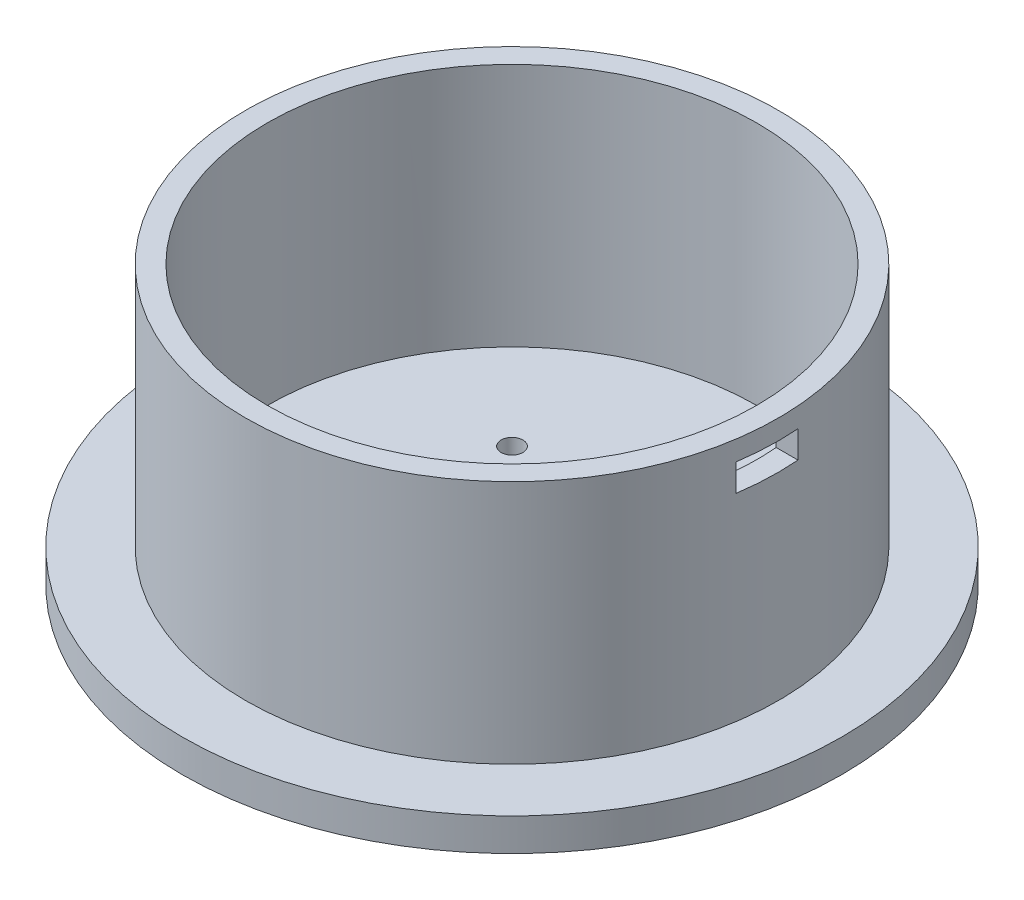
ISO-10303-21;
HEADER;
FILE_DESCRIPTION(('STEP AP214'),'2;1');
FILE_NAME('part.step','',(''),(''),'','','');
FILE_SCHEMA(('AUTOMOTIVE_DESIGN { 1 0 10303 214 1 1 1 1 }'));
ENDSEC;
DATA;
#1=APPLICATION_CONTEXT('core data for automotive mechanical design processes');
#2=APPLICATION_PROTOCOL_DEFINITION('international standard','automotive_design',2000,#1);
#3=PRODUCT_CONTEXT('',#1,'mechanical');
#4=PRODUCT('Part','Part','',(#3));
#5=PRODUCT_RELATED_PRODUCT_CATEGORY('part','',(#4));
#6=PRODUCT_DEFINITION_FORMATION('','',#4);
#7=PRODUCT_DEFINITION_CONTEXT('part definition',#1,'design');
#8=PRODUCT_DEFINITION('design','',#6,#7);
#9=PRODUCT_DEFINITION_SHAPE('','',#8);
#10=(LENGTH_UNIT() NAMED_UNIT(*) SI_UNIT(.MILLI.,.METRE.));
#11=(NAMED_UNIT(*) PLANE_ANGLE_UNIT() SI_UNIT($,.RADIAN.));
#12=(NAMED_UNIT(*) SI_UNIT($,.STERADIAN.) SOLID_ANGLE_UNIT());
#13=UNCERTAINTY_MEASURE_WITH_UNIT(LENGTH_MEASURE(1.E-05),#10,'distance_accuracy_value','');
#14=(GEOMETRIC_REPRESENTATION_CONTEXT(3) GLOBAL_UNCERTAINTY_ASSIGNED_CONTEXT((#13)) GLOBAL_UNIT_ASSIGNED_CONTEXT((#10,
#11,#12)) REPRESENTATION_CONTEXT('',''));
#15=CARTESIAN_POINT('',(0.,0.,0.));
#16=DIRECTION('',(0.,0.,1.));
#17=DIRECTION('',(1.,0.,0.));
#18=AXIS2_PLACEMENT_3D('',#15,#16,#17);
#19=CARTESIAN_POINT('',(-5.23328316127758,49.,-2.27534050490329));
#20=DIRECTION('',(0.,-1.,0.));
#21=DIRECTION('',(0.,0.,-1.));
#22=AXIS2_PLACEMENT_3D('',#19,#20,#21);
#23=CYLINDRICAL_SURFACE('',#22,49.);
#24=CARTESIAN_POINT('',(-5.23328316127758,4.,-2.27534050490329));
#25=DIRECTION('',(0.,1.,0.));
#26=DIRECTION('',(0.,0.,1.));
#27=AXIS2_PLACEMENT_3D('',#24,#25,#26);
#28=CIRCLE('',#27,49.);
#29=CARTESIAN_POINT('',(-5.23328316127758,4.,46.7246594950967));
#30=VERTEX_POINT('',#29);
#31=EDGE_CURVE('E159',#30,#30,#28,.T.);
#32=ORIENTED_EDGE('',*,*,#31,.T.);
#33=EDGE_LOOP('',(#32));
#34=FACE_BOUND('',#33,.T.);
#35=CARTESIAN_POINT('',(-5.23328316127758,49.,-2.27534050490329));
#36=DIRECTION('',(0.,1.,0.));
#37=DIRECTION('',(0.,0.,1.));
#38=AXIS2_PLACEMENT_3D('',#35,#36,#37);
#39=CIRCLE('',#38,49.);
#40=CARTESIAN_POINT('',(-5.23328316127758,49.,46.7246594950967));
#41=VERTEX_POINT('',#40);
#42=EDGE_CURVE('E160',#41,#41,#39,.T.);
#43=ORIENTED_EDGE('',*,*,#42,.F.);
#44=EDGE_LOOP('',(#43));
#45=FACE_BOUND('',#44,.T.);
#46=CARTESIAN_POINT('',(-5.23328316127758,45.3583951692781,-2.27534050490329));
#47=DIRECTION('',(0.,-1.,0.));
#48=DIRECTION('',(0.,0.,-1.));
#49=AXIS2_PLACEMENT_3D('',#46,#47,#48);
#50=CIRCLE('',#49,49.);
#51=CARTESIAN_POINT('',(43.6246222037724,45.3583951692781,-6.00429254801404));
#52=VERTEX_POINT('',#51);
#53=CARTESIAN_POINT('',(43.2242432057236,45.3583951692781,4.99570745198596));
#54=VERTEX_POINT('',#53);
#55=EDGE_CURVE('E171',#52,#54,#50,.T.);
#56=ORIENTED_EDGE('',*,*,#55,.F.);
#57=DIRECTION('',(0.,-1.,0.));
#58=VECTOR('',#57,1.);
#59=CARTESIAN_POINT('',(43.6246222037724,49.,-6.00429254801404));
#60=LINE('',#59,#58);
#61=CARTESIAN_POINT('',(43.6246222037724,40.3583951692781,-6.00429254801404));
#62=VERTEX_POINT('',#61);
#63=EDGE_CURVE('E12',#62,#52,#60,.F.);
#64=ORIENTED_EDGE('',*,*,#63,.F.);
#65=CARTESIAN_POINT('',(-5.23328316127758,40.3583951692781,-2.27534050490329));
#66=DIRECTION('',(0.,-1.,0.));
#67=DIRECTION('',(0.,0.,-1.));
#68=AXIS2_PLACEMENT_3D('',#65,#66,#67);
#69=CIRCLE('',#68,49.);
#70=CARTESIAN_POINT('',(43.2242432057236,40.3583951692781,4.99570745198596));
#71=VERTEX_POINT('',#70);
#72=EDGE_CURVE('E57',#62,#71,#69,.T.);
#73=ORIENTED_EDGE('',*,*,#72,.T.);
#74=DIRECTION('',(0.,-1.,0.));
#75=VECTOR('',#74,1.);
#76=CARTESIAN_POINT('',(43.2242432057236,49.,4.99570745198596));
#77=LINE('',#76,#75);
#78=EDGE_CURVE('E173',#71,#54,#77,.F.);
#79=ORIENTED_EDGE('',*,*,#78,.T.);
#80=EDGE_LOOP('',(#56,#64,#73,#79));
#81=FACE_BOUND('',#80,.T.);
#82=ADVANCED_FACE('F49',(#34,#45,#81),#23,.T.);
#83=CARTESIAN_POINT('',(-5.23328316127758,4.,-2.27534050490329));
#84=DIRECTION('',(0.,-1.,0.));
#85=DIRECTION('',(0.,0.,-1.));
#86=AXIS2_PLACEMENT_3D('',#83,#84,#85);
#87=CYLINDRICAL_SURFACE('',#86,45.);
#88=CARTESIAN_POINT('',(-5.23328316127758,40.3583951692781,-2.27534050490329));
#89=DIRECTION('',(0.,-1.,0.));
#90=DIRECTION('',(0.,0.,-1.));
#91=AXIS2_PLACEMENT_3D('',#88,#89,#90);
#92=CIRCLE('',#91,45.);
#93=CARTESIAN_POINT('',(39.6119497699959,40.3583951692781,-6.00429254801404));
#94=VERTEX_POINT('',#93);
#95=CARTESIAN_POINT('',(39.1754081232966,40.3583951692781,4.99570745198596));
#96=VERTEX_POINT('',#95);
#97=EDGE_CURVE('E100',#94,#96,#92,.T.);
#98=ORIENTED_EDGE('',*,*,#97,.F.);
#99=DIRECTION('',(0.,-1.,0.));
#100=VECTOR('',#99,1.);
#101=CARTESIAN_POINT('',(39.6119497699959,4.,-6.00429254801404));
#102=LINE('',#101,#100);
#103=CARTESIAN_POINT('',(39.6119497699959,45.3583951692781,-6.00429254801404));
#104=VERTEX_POINT('',#103);
#105=EDGE_CURVE('E89',#94,#104,#102,.F.);
#106=ORIENTED_EDGE('',*,*,#105,.T.);
#107=CARTESIAN_POINT('',(-5.23328316127758,45.3583951692781,-2.27534050490329));
#108=DIRECTION('',(0.,-1.,0.));
#109=DIRECTION('',(0.,0.,-1.));
#110=AXIS2_PLACEMENT_3D('',#107,#108,#109);
#111=CIRCLE('',#110,45.);
#112=CARTESIAN_POINT('',(39.1754081232966,45.3583951692781,4.99570745198596));
#113=VERTEX_POINT('',#112);
#114=EDGE_CURVE('E96',#104,#113,#111,.T.);
#115=ORIENTED_EDGE('',*,*,#114,.T.);
#116=DIRECTION('',(0.,-1.,0.));
#117=VECTOR('',#116,1.);
#118=CARTESIAN_POINT('',(39.1754081232966,4.,4.99570745198596));
#119=LINE('',#118,#117);
#120=EDGE_CURVE('E106',#96,#113,#119,.F.);
#121=ORIENTED_EDGE('',*,*,#120,.F.);
#122=EDGE_LOOP('',(#98,#106,#115,#121));
#123=FACE_BOUND('',#122,.T.);
#124=CARTESIAN_POINT('',(-5.23328316127758,49.,-2.27534050490329));
#125=DIRECTION('',(0.,1.,0.));
#126=DIRECTION('',(0.,0.,1.));
#127=AXIS2_PLACEMENT_3D('',#124,#125,#126);
#128=CIRCLE('',#127,45.);
#129=CARTESIAN_POINT('',(-5.23328316127758,49.,42.7246594950967));
#130=VERTEX_POINT('',#129);
#131=EDGE_CURVE('E156',#130,#130,#128,.T.);
#132=ORIENTED_EDGE('',*,*,#131,.T.);
#133=EDGE_LOOP('',(#132));
#134=FACE_BOUND('',#133,.T.);
#135=CARTESIAN_POINT('',(-5.23328316127758,4.,-2.27534050490329));
#136=DIRECTION('',(0.,-1.,0.));
#137=DIRECTION('',(0.,0.,-1.));
#138=AXIS2_PLACEMENT_3D('',#135,#136,#137);
#139=CIRCLE('',#138,45.);
#140=CARTESIAN_POINT('',(-5.23328316127758,4.,-47.2753405049033));
#141=VERTEX_POINT('',#140);
#142=EDGE_CURVE('E151',#141,#141,#139,.T.);
#143=ORIENTED_EDGE('',*,*,#142,.T.);
#144=EDGE_LOOP('',(#143));
#145=FACE_BOUND('',#144,.T.);
#146=ADVANCED_FACE('F104',(#123,#134,#145),#87,.F.);
#147=CARTESIAN_POINT('',(-5.23328316127758,4.,-2.27534050490329));
#148=DIRECTION('',(0.,1.,0.));
#149=DIRECTION('',(0.,0.,1.));
#150=AXIS2_PLACEMENT_3D('',#147,#148,#149);
#151=PLANE('',#150);
#152=CARTESIAN_POINT('',(-5.23328316127758,4.,-2.27534050490329));
#153=DIRECTION('',(0.,1.,0.));
#154=DIRECTION('',(0.,0.,1.));
#155=AXIS2_PLACEMENT_3D('',#152,#153,#154);
#156=CIRCLE('',#155,60.625);
#157=CARTESIAN_POINT('',(-5.23328316127758,4.,58.3496594950967));
#158=VERTEX_POINT('',#157);
#159=EDGE_CURVE('E163',#158,#158,#156,.T.);
#160=ORIENTED_EDGE('',*,*,#159,.T.);
#161=EDGE_LOOP('',(#160));
#162=FACE_BOUND('',#161,.T.);
#163=ORIENTED_EDGE('',*,*,#31,.F.);
#164=EDGE_LOOP('',(#163));
#165=FACE_BOUND('',#164,.T.);
#166=ADVANCED_FACE('F201',(#162,#165),#151,.T.);
#167=CARTESIAN_POINT('',(-5.23328316127758,4.,-2.27534050490329));
#168=DIRECTION('',(0.,-1.,0.));
#169=DIRECTION('',(0.,0.,-1.));
#170=AXIS2_PLACEMENT_3D('',#167,#168,#169);
#171=CYLINDRICAL_SURFACE('',#170,60.625);
#172=ORIENTED_EDGE('',*,*,#159,.F.);
#173=EDGE_LOOP('',(#172));
#174=FACE_BOUND('',#173,.T.);
#175=CARTESIAN_POINT('',(-5.23328316127758,-2.,-2.27534050490329));
#176=DIRECTION('',(0.,-1.,0.));
#177=DIRECTION('',(0.,0.,-1.));
#178=AXIS2_PLACEMENT_3D('',#175,#176,#177);
#179=CIRCLE('',#178,60.625);
#180=CARTESIAN_POINT('',(-5.23328316127758,-2.,-62.9003405049033));
#181=VERTEX_POINT('',#180);
#182=EDGE_CURVE('E148',#181,#181,#179,.T.);
#183=ORIENTED_EDGE('',*,*,#182,.F.);
#184=EDGE_LOOP('',(#183));
#185=FACE_BOUND('',#184,.T.);
#186=ADVANCED_FACE('F51',(#174,#185),#171,.T.);
#187=CARTESIAN_POINT('',(-5.23328316127758,49.,-2.27534050490329));
#188=DIRECTION('',(0.,1.,0.));
#189=DIRECTION('',(0.,0.,1.));
#190=AXIS2_PLACEMENT_3D('',#187,#188,#189);
#191=PLANE('',#190);
#192=ORIENTED_EDGE('',*,*,#42,.T.);
#193=EDGE_LOOP('',(#192));
#194=FACE_BOUND('',#193,.T.);
#195=ORIENTED_EDGE('',*,*,#131,.F.);
#196=EDGE_LOOP('',(#195));
#197=FACE_BOUND('',#196,.T.);
#198=ADVANCED_FACE('F205',(#194,#197),#191,.T.);
#199=CARTESIAN_POINT('',(-5.23328316127758,4.,-2.27534050490329));
#200=DIRECTION('',(0.,-1.,0.));
#201=DIRECTION('',(0.,0.,-1.));
#202=AXIS2_PLACEMENT_3D('',#199,#200,#201);
#203=PLANE('',#202);
#204=CARTESIAN_POINT('',(-5.23328316127758,4.,-2.27534050490329));
#205=DIRECTION('',(0.,-1.,0.));
#206=DIRECTION('',(0.,0.,-1.));
#207=AXIS2_PLACEMENT_3D('',#204,#205,#206);
#208=CIRCLE('',#207,2.5);
#209=CARTESIAN_POINT('',(-5.23328316127758,4.,-4.77534050490329));
#210=VERTEX_POINT('',#209);
#211=EDGE_CURVE('E138',#210,#210,#208,.T.);
#212=ORIENTED_EDGE('',*,*,#211,.T.);
#213=EDGE_LOOP('',(#212));
#214=FACE_BOUND('',#213,.T.);
#215=CARTESIAN_POINT('',(-21.2332831612776,4.,13.7246594950967));
#216=DIRECTION('',(0.,-1.,0.));
#217=DIRECTION('',(0.,0.,-1.));
#218=AXIS2_PLACEMENT_3D('',#215,#216,#217);
#219=CIRCLE('',#218,2.);
#220=CARTESIAN_POINT('',(-21.2332831612776,4.,11.7246594950967));
#221=VERTEX_POINT('',#220);
#222=EDGE_CURVE('E135',#221,#221,#219,.T.);
#223=ORIENTED_EDGE('',*,*,#222,.T.);
#224=EDGE_LOOP('',(#223));
#225=FACE_BOUND('',#224,.T.);
#226=CARTESIAN_POINT('',(10.7667168387224,4.,13.7246594950967));
#227=DIRECTION('',(0.,-1.,0.));
#228=DIRECTION('',(0.,0.,-1.));
#229=AXIS2_PLACEMENT_3D('',#226,#227,#228);
#230=CIRCLE('',#229,2.);
#231=CARTESIAN_POINT('',(10.7667168387224,4.,11.7246594950967));
#232=VERTEX_POINT('',#231);
#233=EDGE_CURVE('E132',#232,#232,#230,.T.);
#234=ORIENTED_EDGE('',*,*,#233,.T.);
#235=EDGE_LOOP('',(#234));
#236=FACE_BOUND('',#235,.T.);
#237=CARTESIAN_POINT('',(10.7667168387224,4.,-18.2753405049033));
#238=DIRECTION('',(0.,-1.,0.));
#239=DIRECTION('',(0.,0.,-1.));
#240=AXIS2_PLACEMENT_3D('',#237,#238,#239);
#241=CIRCLE('',#240,2.);
#242=CARTESIAN_POINT('',(10.7667168387224,4.,-20.2753405049033));
#243=VERTEX_POINT('',#242);
#244=EDGE_CURVE('E129',#243,#243,#241,.T.);
#245=ORIENTED_EDGE('',*,*,#244,.T.);
#246=EDGE_LOOP('',(#245));
#247=FACE_BOUND('',#246,.T.);
#248=CARTESIAN_POINT('',(-21.2332831612776,4.,-18.2753405049033));
#249=DIRECTION('',(0.,-1.,0.));
#250=DIRECTION('',(0.,0.,-1.));
#251=AXIS2_PLACEMENT_3D('',#248,#249,#250);
#252=CIRCLE('',#251,2.);
#253=CARTESIAN_POINT('',(-21.2332831612776,4.,-20.2753405049033));
#254=VERTEX_POINT('',#253);
#255=EDGE_CURVE('E126',#254,#254,#252,.T.);
#256=ORIENTED_EDGE('',*,*,#255,.T.);
#257=EDGE_LOOP('',(#256));
#258=FACE_BOUND('',#257,.T.);
#259=ORIENTED_EDGE('',*,*,#142,.F.);
#260=EDGE_LOOP('',(#259));
#261=FACE_BOUND('',#260,.T.);
#262=ADVANCED_FACE('F230',(#214,#225,#236,#247,#258,#261),#203,.F.);
#263=CARTESIAN_POINT('',(-5.23328316127758,-2.,-2.27534050490329));
#264=DIRECTION('',(0.,1.,0.));
#265=DIRECTION('',(0.,0.,1.));
#266=AXIS2_PLACEMENT_3D('',#263,#264,#265);
#267=CYLINDRICAL_SURFACE('',#266,56.502019498544);
#268=CARTESIAN_POINT('',(-5.23328316127758,-2.,-2.27534050490329));
#269=DIRECTION('',(0.,-1.,0.));
#270=DIRECTION('',(0.,0.,-1.));
#271=AXIS2_PLACEMENT_3D('',#268,#269,#270);
#272=CIRCLE('',#271,56.502019498544);
#273=CARTESIAN_POINT('',(-5.23328316127758,-2.,-58.7773600034473));
#274=VERTEX_POINT('',#273);
#275=EDGE_CURVE('E145',#274,#274,#272,.T.);
#276=ORIENTED_EDGE('',*,*,#275,.T.);
#277=EDGE_LOOP('',(#276));
#278=FACE_BOUND('',#277,.T.);
#279=CARTESIAN_POINT('',(-5.23328316127758,0.,-2.27534050490329));
#280=DIRECTION('',(0.,-1.,0.));
#281=DIRECTION('',(0.,0.,-1.));
#282=AXIS2_PLACEMENT_3D('',#279,#280,#281);
#283=CIRCLE('',#282,56.502019498544);
#284=CARTESIAN_POINT('',(-5.23328316127758,0.,-58.7773600034473));
#285=VERTEX_POINT('',#284);
#286=EDGE_CURVE('E144',#285,#285,#283,.T.);
#287=ORIENTED_EDGE('',*,*,#286,.F.);
#288=EDGE_LOOP('',(#287));
#289=FACE_BOUND('',#288,.T.);
#290=ADVANCED_FACE('F222',(#278,#289),#267,.F.);
#291=CARTESIAN_POINT('',(0.,-2.,0.));
#292=DIRECTION('',(0.,-1.,0.));
#293=DIRECTION('',(0.,0.,-1.));
#294=AXIS2_PLACEMENT_3D('',#291,#292,#293);
#295=PLANE('',#294);
#296=ORIENTED_EDGE('',*,*,#275,.F.);
#297=EDGE_LOOP('',(#296));
#298=FACE_BOUND('',#297,.T.);
#299=ORIENTED_EDGE('',*,*,#182,.T.);
#300=EDGE_LOOP('',(#299));
#301=FACE_BOUND('',#300,.T.);
#302=ADVANCED_FACE('F213',(#298,#301),#295,.T.);
#303=CARTESIAN_POINT('',(-5.23328316127758,0.,-2.27534050490329));
#304=DIRECTION('',(0.,1.,0.));
#305=DIRECTION('',(0.,0.,1.));
#306=AXIS2_PLACEMENT_3D('',#303,#304,#305);
#307=PLANE('',#306);
#308=CARTESIAN_POINT('',(-5.23328316127758,0.,-2.27534050490329));
#309=DIRECTION('',(0.,1.,0.));
#310=DIRECTION('',(0.,0.,1.));
#311=AXIS2_PLACEMENT_3D('',#308,#309,#310);
#312=CIRCLE('',#311,46.5020194985441);
#313=CARTESIAN_POINT('',(-5.23328316127758,0.,44.2266789936408));
#314=VERTEX_POINT('',#313);
#315=EDGE_CURVE('E168',#314,#314,#312,.F.);
#316=ORIENTED_EDGE('',*,*,#315,.F.);
#317=EDGE_LOOP('',(#316));
#318=FACE_BOUND('',#317,.T.);
#319=ORIENTED_EDGE('',*,*,#286,.T.);
#320=EDGE_LOOP('',(#319));
#321=FACE_BOUND('',#320,.T.);
#322=ADVANCED_FACE('F210',(#318,#321),#307,.F.);
#323=CARTESIAN_POINT('',(-5.23328316127758,-2.,-2.27534050490329));
#324=DIRECTION('',(0.,1.,0.));
#325=DIRECTION('',(0.,0.,1.));
#326=AXIS2_PLACEMENT_3D('',#323,#324,#325);
#327=CYLINDRICAL_SURFACE('',#326,46.5020194985441);
#328=CARTESIAN_POINT('',(-5.23328316127758,-2.,-2.27534050490329));
#329=DIRECTION('',(0.,-1.,0.));
#330=DIRECTION('',(0.,0.,-1.));
#331=AXIS2_PLACEMENT_3D('',#328,#329,#330);
#332=CIRCLE('',#331,46.5020194985441);
#333=CARTESIAN_POINT('',(-5.23328316127758,-2.,-48.7773600034473));
#334=VERTEX_POINT('',#333);
#335=EDGE_CURVE('E141',#334,#334,#332,.T.);
#336=ORIENTED_EDGE('',*,*,#335,.F.);
#337=EDGE_LOOP('',(#336));
#338=FACE_BOUND('',#337,.T.);
#339=ORIENTED_EDGE('',*,*,#315,.T.);
#340=EDGE_LOOP('',(#339));
#341=FACE_BOUND('',#340,.T.);
#342=ADVANCED_FACE('F212',(#338,#341),#327,.T.);
#343=CARTESIAN_POINT('',(0.,-2.,0.));
#344=DIRECTION('',(0.,-1.,0.));
#345=DIRECTION('',(0.,0.,-1.));
#346=AXIS2_PLACEMENT_3D('',#343,#344,#345);
#347=PLANE('',#346);
#348=CARTESIAN_POINT('',(-5.23328316127758,-2.,-2.27534050490329));
#349=DIRECTION('',(0.,-1.,0.));
#350=DIRECTION('',(0.,0.,-1.));
#351=AXIS2_PLACEMENT_3D('',#348,#349,#350);
#352=CIRCLE('',#351,2.5);
#353=CARTESIAN_POINT('',(-5.23328316127758,-2.,-4.77534050490329));
#354=VERTEX_POINT('',#353);
#355=EDGE_CURVE('E107',#354,#354,#352,.T.);
#356=ORIENTED_EDGE('',*,*,#355,.F.);
#357=EDGE_LOOP('',(#356));
#358=FACE_BOUND('',#357,.T.);
#359=CARTESIAN_POINT('',(-21.2332831612776,-2.,13.7246594950967));
#360=DIRECTION('',(0.,-1.,0.));
#361=DIRECTION('',(0.,0.,-1.));
#362=AXIS2_PLACEMENT_3D('',#359,#360,#361);
#363=CIRCLE('',#362,2.);
#364=CARTESIAN_POINT('',(-21.2332831612776,-2.,11.7246594950967));
#365=VERTEX_POINT('',#364);
#366=EDGE_CURVE('E110',#365,#365,#363,.T.);
#367=ORIENTED_EDGE('',*,*,#366,.F.);
#368=EDGE_LOOP('',(#367));
#369=FACE_BOUND('',#368,.T.);
#370=CARTESIAN_POINT('',(10.7667168387224,-2.,13.7246594950967));
#371=DIRECTION('',(0.,-1.,0.));
#372=DIRECTION('',(0.,0.,-1.));
#373=AXIS2_PLACEMENT_3D('',#370,#371,#372);
#374=CIRCLE('',#373,2.);
#375=CARTESIAN_POINT('',(10.7667168387224,-2.,11.7246594950967));
#376=VERTEX_POINT('',#375);
#377=EDGE_CURVE('E119',#376,#376,#374,.T.);
#378=ORIENTED_EDGE('',*,*,#377,.F.);
#379=EDGE_LOOP('',(#378));
#380=FACE_BOUND('',#379,.T.);
#381=CARTESIAN_POINT('',(10.7667168387224,-2.,-18.2753405049033));
#382=DIRECTION('',(0.,-1.,0.));
#383=DIRECTION('',(0.,0.,-1.));
#384=AXIS2_PLACEMENT_3D('',#381,#382,#383);
#385=CIRCLE('',#384,2.);
#386=CARTESIAN_POINT('',(10.7667168387224,-2.,-20.2753405049033));
#387=VERTEX_POINT('',#386);
#388=EDGE_CURVE('E115',#387,#387,#385,.T.);
#389=ORIENTED_EDGE('',*,*,#388,.F.);
#390=EDGE_LOOP('',(#389));
#391=FACE_BOUND('',#390,.T.);
#392=CARTESIAN_POINT('',(-21.2332831612776,-2.,-18.2753405049033));
#393=DIRECTION('',(0.,-1.,0.));
#394=DIRECTION('',(0.,0.,-1.));
#395=AXIS2_PLACEMENT_3D('',#392,#393,#394);
#396=CIRCLE('',#395,2.);
#397=CARTESIAN_POINT('',(-21.2332831612776,-2.,-20.2753405049033));
#398=VERTEX_POINT('',#397);
#399=EDGE_CURVE('E118',#398,#398,#396,.T.);
#400=ORIENTED_EDGE('',*,*,#399,.F.);
#401=EDGE_LOOP('',(#400));
#402=FACE_BOUND('',#401,.T.);
#403=ORIENTED_EDGE('',*,*,#335,.T.);
#404=EDGE_LOOP('',(#403));
#405=FACE_BOUND('',#404,.T.);
#406=ADVANCED_FACE('F219',(#358,#369,#380,#391,#402,#405),#347,.T.);
#407=CARTESIAN_POINT('',(-21.2332831612776,8.,-18.2753405049033));
#408=DIRECTION('',(0.,-1.,0.));
#409=DIRECTION('',(0.,0.,-1.));
#410=AXIS2_PLACEMENT_3D('',#407,#408,#409);
#411=CYLINDRICAL_SURFACE('',#410,2.);
#412=ORIENTED_EDGE('',*,*,#399,.T.);
#413=EDGE_LOOP('',(#412));
#414=FACE_BOUND('',#413,.T.);
#415=ORIENTED_EDGE('',*,*,#255,.F.);
#416=EDGE_LOOP('',(#415));
#417=FACE_BOUND('',#416,.T.);
#418=ADVANCED_FACE('F241',(#414,#417),#411,.F.);
#419=CARTESIAN_POINT('',(10.7667168387224,8.,-18.2753405049033));
#420=DIRECTION('',(0.,-1.,0.));
#421=DIRECTION('',(0.,0.,-1.));
#422=AXIS2_PLACEMENT_3D('',#419,#420,#421);
#423=CYLINDRICAL_SURFACE('',#422,2.);
#424=ORIENTED_EDGE('',*,*,#388,.T.);
#425=EDGE_LOOP('',(#424));
#426=FACE_BOUND('',#425,.T.);
#427=ORIENTED_EDGE('',*,*,#244,.F.);
#428=EDGE_LOOP('',(#427));
#429=FACE_BOUND('',#428,.T.);
#430=ADVANCED_FACE('F245',(#426,#429),#423,.F.);
#431=CARTESIAN_POINT('',(10.7667168387224,8.,13.7246594950967));
#432=DIRECTION('',(0.,-1.,0.));
#433=DIRECTION('',(0.,0.,-1.));
#434=AXIS2_PLACEMENT_3D('',#431,#432,#433);
#435=CYLINDRICAL_SURFACE('',#434,2.);
#436=ORIENTED_EDGE('',*,*,#377,.T.);
#437=EDGE_LOOP('',(#436));
#438=FACE_BOUND('',#437,.T.);
#439=ORIENTED_EDGE('',*,*,#233,.F.);
#440=EDGE_LOOP('',(#439));
#441=FACE_BOUND('',#440,.T.);
#442=ADVANCED_FACE('F253',(#438,#441),#435,.F.);
#443=CARTESIAN_POINT('',(-21.2332831612776,8.,13.7246594950967));
#444=DIRECTION('',(0.,-1.,0.));
#445=DIRECTION('',(0.,0.,-1.));
#446=AXIS2_PLACEMENT_3D('',#443,#444,#445);
#447=CYLINDRICAL_SURFACE('',#446,2.);
#448=ORIENTED_EDGE('',*,*,#366,.T.);
#449=EDGE_LOOP('',(#448));
#450=FACE_BOUND('',#449,.T.);
#451=ORIENTED_EDGE('',*,*,#222,.F.);
#452=EDGE_LOOP('',(#451));
#453=FACE_BOUND('',#452,.T.);
#454=ADVANCED_FACE('F249',(#450,#453),#447,.F.);
#455=CARTESIAN_POINT('',(-5.23328316127758,8.,-2.27534050490329));
#456=DIRECTION('',(0.,-1.,0.));
#457=DIRECTION('',(0.,0.,-1.));
#458=AXIS2_PLACEMENT_3D('',#455,#456,#457);
#459=CYLINDRICAL_SURFACE('',#458,2.5);
#460=ORIENTED_EDGE('',*,*,#355,.T.);
#461=EDGE_LOOP('',(#460));
#462=FACE_BOUND('',#461,.T.);
#463=ORIENTED_EDGE('',*,*,#211,.F.);
#464=EDGE_LOOP('',(#463));
#465=FACE_BOUND('',#464,.T.);
#466=ADVANCED_FACE('F193',(#462,#465),#459,.F.);
#467=CARTESIAN_POINT('',(33.7667168387224,40.3583951692781,4.99570745198596));
#468=DIRECTION('',(0.,-1.,0.));
#469=DIRECTION('',(0.,0.,-1.));
#470=AXIS2_PLACEMENT_3D('',#467,#468,#469);
#471=PLANE('',#470);
#472=ORIENTED_EDGE('',*,*,#97,.T.);
#473=DIRECTION('',(1.,0.,0.));
#474=VECTOR('',#473,1.);
#475=CARTESIAN_POINT('',(33.7667168387224,40.3583951692781,4.99570745198596));
#476=LINE('',#475,#474);
#477=EDGE_CURVE('E97',#96,#71,#476,.T.);
#478=ORIENTED_EDGE('',*,*,#477,.T.);
#479=ORIENTED_EDGE('',*,*,#72,.F.);
#480=DIRECTION('',(1.,0.,0.));
#481=VECTOR('',#480,1.);
#482=CARTESIAN_POINT('',(33.7667168387224,40.3583951692781,-6.00429254801404));
#483=LINE('',#482,#481);
#484=EDGE_CURVE('E91',#94,#62,#483,.T.);
#485=ORIENTED_EDGE('',*,*,#484,.F.);
#486=EDGE_LOOP('',(#472,#478,#479,#485));
#487=FACE_BOUND('',#486,.T.);
#488=ADVANCED_FACE('F99',(#487),#471,.F.);
#489=CARTESIAN_POINT('',(33.7667168387224,45.3583951692781,4.99570745198596));
#490=DIRECTION('',(0.,0.,1.));
#491=DIRECTION('',(1.,0.,0.));
#492=AXIS2_PLACEMENT_3D('',#489,#490,#491);
#493=PLANE('',#492);
#494=ORIENTED_EDGE('',*,*,#120,.T.);
#495=DIRECTION('',(1.,0.,0.));
#496=VECTOR('',#495,1.);
#497=CARTESIAN_POINT('',(33.7667168387224,45.3583951692781,4.99570745198596));
#498=LINE('',#497,#496);
#499=EDGE_CURVE('E180',#113,#54,#498,.T.);
#500=ORIENTED_EDGE('',*,*,#499,.T.);
#501=ORIENTED_EDGE('',*,*,#78,.F.);
#502=ORIENTED_EDGE('',*,*,#477,.F.);
#503=EDGE_LOOP('',(#494,#500,#501,#502));
#504=FACE_BOUND('',#503,.T.);
#505=ADVANCED_FACE('F185',(#504),#493,.F.);
#506=CARTESIAN_POINT('',(33.7667168387224,45.3583951692781,4.99570745198596));
#507=DIRECTION('',(0.,-1.,0.));
#508=DIRECTION('',(0.,0.,-1.));
#509=AXIS2_PLACEMENT_3D('',#506,#507,#508);
#510=PLANE('',#509);
#511=DIRECTION('',(1.,0.,0.));
#512=VECTOR('',#511,1.);
#513=CARTESIAN_POINT('',(33.7667168387224,45.3583951692781,-6.00429254801404));
#514=LINE('',#513,#512);
#515=EDGE_CURVE('E63',#104,#52,#514,.T.);
#516=ORIENTED_EDGE('',*,*,#515,.T.);
#517=ORIENTED_EDGE('',*,*,#55,.T.);
#518=ORIENTED_EDGE('',*,*,#499,.F.);
#519=ORIENTED_EDGE('',*,*,#114,.F.);
#520=EDGE_LOOP('',(#516,#517,#518,#519));
#521=FACE_BOUND('',#520,.T.);
#522=ADVANCED_FACE('F177',(#521),#510,.T.);
#523=CARTESIAN_POINT('',(33.7667168387224,45.3583951692781,-6.00429254801404));
#524=DIRECTION('',(0.,0.,1.));
#525=DIRECTION('',(1.,0.,0.));
#526=AXIS2_PLACEMENT_3D('',#523,#524,#525);
#527=PLANE('',#526);
#528=ORIENTED_EDGE('',*,*,#484,.T.);
#529=ORIENTED_EDGE('',*,*,#63,.T.);
#530=ORIENTED_EDGE('',*,*,#515,.F.);
#531=ORIENTED_EDGE('',*,*,#105,.F.);
#532=EDGE_LOOP('',(#528,#529,#530,#531));
#533=FACE_BOUND('',#532,.T.);
#534=ADVANCED_FACE('F90',(#533),#527,.T.);
#535=CLOSED_SHELL('',(#82,#146,#166,#186,#198,#262,#290,#302,#322,#342,#406,#418,#430,#442,#454,
#466,#488,#505,#522,#534));
#536=MANIFOLD_SOLID_BREP('B2',#535);
#537=ADVANCED_BREP_SHAPE_REPRESENTATION('',(#18,#536),#14);
#538=SHAPE_DEFINITION_REPRESENTATION(#9,#537);
ENDSEC;
END-ISO-10303-21;
